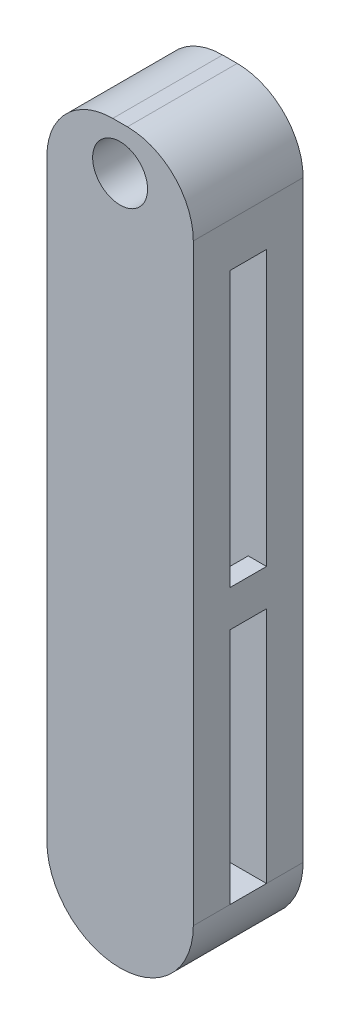
ISO-10303-21;
HEADER;
FILE_DESCRIPTION(('STEP AP214'),'2;1');
FILE_NAME('part.step','',(''),(''),'','','');
FILE_SCHEMA(('AUTOMOTIVE_DESIGN { 1 0 10303 214 1 1 1 1 }'));
ENDSEC;
DATA;
#1=APPLICATION_CONTEXT('core data for automotive mechanical design processes');
#2=APPLICATION_PROTOCOL_DEFINITION('international standard','automotive_design',2000,#1);
#3=PRODUCT_CONTEXT('',#1,'mechanical');
#4=PRODUCT('Part','Part','',(#3));
#5=PRODUCT_RELATED_PRODUCT_CATEGORY('part','',(#4));
#6=PRODUCT_DEFINITION_FORMATION('','',#4);
#7=PRODUCT_DEFINITION_CONTEXT('part definition',#1,'design');
#8=PRODUCT_DEFINITION('design','',#6,#7);
#9=PRODUCT_DEFINITION_SHAPE('','',#8);
#10=(LENGTH_UNIT() NAMED_UNIT(*) SI_UNIT(.MILLI.,.METRE.));
#11=(NAMED_UNIT(*) PLANE_ANGLE_UNIT() SI_UNIT($,.RADIAN.));
#12=(NAMED_UNIT(*) SI_UNIT($,.STERADIAN.) SOLID_ANGLE_UNIT());
#13=UNCERTAINTY_MEASURE_WITH_UNIT(LENGTH_MEASURE(1.E-05),#10,'distance_accuracy_value','');
#14=(GEOMETRIC_REPRESENTATION_CONTEXT(3) GLOBAL_UNCERTAINTY_ASSIGNED_CONTEXT((#13)) GLOBAL_UNIT_ASSIGNED_CONTEXT((#10,
#11,#12)) REPRESENTATION_CONTEXT('',''));
#15=CARTESIAN_POINT('',(0.,0.,0.));
#16=DIRECTION('',(0.,0.,1.));
#17=DIRECTION('',(1.,0.,0.));
#18=AXIS2_PLACEMENT_3D('',#15,#16,#17);
#19=CARTESIAN_POINT('',(20.,-80.,10.));
#20=DIRECTION('',(0.,0.,-1.));
#21=DIRECTION('',(0.,1.,0.));
#22=AXIS2_PLACEMENT_3D('',#19,#20,#21);
#23=PLANE('',#22);
#24=DIRECTION('',(0.,1.,0.));
#25=VECTOR('',#24,1.);
#26=CARTESIAN_POINT('',(15.,-80.,10.));
#27=LINE('',#26,#25);
#28=CARTESIAN_POINT('',(15.,-15.,10.));
#29=VERTEX_POINT('',#28);
#30=CARTESIAN_POINT('',(15.,-5.00000000000001,10.));
#31=VERTEX_POINT('',#30);
#32=EDGE_CURVE('E209',#29,#31,#27,.T.);
#33=ORIENTED_EDGE('',*,*,#32,.T.);
#34=DIRECTION('',(1.,0.,0.));
#35=VECTOR('',#34,1.);
#36=CARTESIAN_POINT('',(20.,-5.,10.));
#37=LINE('',#36,#35);
#38=CARTESIAN_POINT('',(20.,-5.,10.));
#39=VERTEX_POINT('',#38);
#40=EDGE_CURVE('E173',#31,#39,#37,.T.);
#41=ORIENTED_EDGE('',*,*,#40,.T.);
#42=DIRECTION('',(0.,-1.,0.));
#43=VECTOR('',#42,1.);
#44=CARTESIAN_POINT('',(20.,-80.,10.));
#45=LINE('',#44,#43);
#46=CARTESIAN_POINT('',(20.,70.,10.));
#47=VERTEX_POINT('',#46);
#48=EDGE_CURVE('E253',#47,#39,#45,.T.);
#49=ORIENTED_EDGE('',*,*,#48,.F.);
#50=DIRECTION('',(-1.,0.,0.));
#51=VECTOR('',#50,1.);
#52=CARTESIAN_POINT('',(20.,70.,10.));
#53=LINE('',#52,#51);
#54=CARTESIAN_POINT('',(-20.,70.,10.));
#55=VERTEX_POINT('',#54);
#56=EDGE_CURVE('E286',#47,#55,#53,.T.);
#57=ORIENTED_EDGE('',*,*,#56,.T.);
#58=DIRECTION('',(0.,-1.,0.));
#59=VECTOR('',#58,1.);
#60=CARTESIAN_POINT('',(-20.,-80.,10.));
#61=LINE('',#60,#59);
#62=CARTESIAN_POINT('',(-20.,-5.,10.));
#63=VERTEX_POINT('',#62);
#64=EDGE_CURVE('E271',#55,#63,#61,.T.);
#65=ORIENTED_EDGE('',*,*,#64,.T.);
#66=DIRECTION('',(-1.,0.,0.));
#67=VECTOR('',#66,1.);
#68=CARTESIAN_POINT('',(20.,-5.,10.));
#69=LINE('',#68,#67);
#70=CARTESIAN_POINT('',(-15.,-5.,10.));
#71=VERTEX_POINT('',#70);
#72=EDGE_CURVE('E240',#71,#63,#69,.T.);
#73=ORIENTED_EDGE('',*,*,#72,.F.);
#74=DIRECTION('',(0.,1.,0.));
#75=VECTOR('',#74,1.);
#76=CARTESIAN_POINT('',(-15.,-80.,10.));
#77=LINE('',#76,#75);
#78=CARTESIAN_POINT('',(-15.,-15.,10.));
#79=VERTEX_POINT('',#78);
#80=EDGE_CURVE('E248',#79,#71,#77,.T.);
#81=ORIENTED_EDGE('',*,*,#80,.F.);
#82=DIRECTION('',(1.,0.,0.));
#83=VECTOR('',#82,1.);
#84=CARTESIAN_POINT('',(20.,-15.,10.));
#85=LINE('',#84,#83);
#86=CARTESIAN_POINT('',(-20.,-15.,10.));
#87=VERTEX_POINT('',#86);
#88=EDGE_CURVE('E244',#87,#79,#85,.T.);
#89=ORIENTED_EDGE('',*,*,#88,.F.);
#90=CARTESIAN_POINT('',(-20.,-80.,10.));
#91=VERTEX_POINT('',#90);
#92=EDGE_CURVE('E252',#87,#91,#61,.T.);
#93=ORIENTED_EDGE('',*,*,#92,.T.);
#94=DIRECTION('',(-1.,0.,0.));
#95=VECTOR('',#94,1.);
#96=CARTESIAN_POINT('',(20.,-80.,10.));
#97=LINE('',#96,#95);
#98=CARTESIAN_POINT('',(20.,-80.,10.));
#99=VERTEX_POINT('',#98);
#100=EDGE_CURVE('E270',#99,#91,#97,.T.);
#101=ORIENTED_EDGE('',*,*,#100,.F.);
#102=CARTESIAN_POINT('',(20.,-15.,10.));
#103=VERTEX_POINT('',#102);
#104=EDGE_CURVE('E258',#103,#99,#45,.T.);
#105=ORIENTED_EDGE('',*,*,#104,.F.);
#106=DIRECTION('',(-1.,0.,0.));
#107=VECTOR('',#106,1.);
#108=CARTESIAN_POINT('',(20.,-15.,10.));
#109=LINE('',#108,#107);
#110=EDGE_CURVE('E177',#103,#29,#109,.T.);
#111=ORIENTED_EDGE('',*,*,#110,.T.);
#112=EDGE_LOOP('',(#33,#41,#49,#57,#65,#73,#81,#89,#93,#101,#105,#111));
#113=FACE_BOUND('',#112,.T.);
#114=ADVANCED_FACE('F39',(#113),#23,.F.);
#115=CARTESIAN_POINT('',(20.,-80.,20.));
#116=DIRECTION('',(0.,0.,1.));
#117=DIRECTION('',(1.,0.,0.));
#118=AXIS2_PLACEMENT_3D('',#115,#116,#117);
#119=PLANE('',#118);
#120=DIRECTION('',(0.,1.,0.));
#121=VECTOR('',#120,1.);
#122=CARTESIAN_POINT('',(20.,-80.,20.));
#123=LINE('',#122,#121);
#124=CARTESIAN_POINT('',(20.,-5.,20.));
#125=VERTEX_POINT('',#124);
#126=CARTESIAN_POINT('',(20.,70.,20.));
#127=VERTEX_POINT('',#126);
#128=EDGE_CURVE('E190',#125,#127,#123,.T.);
#129=ORIENTED_EDGE('',*,*,#128,.F.);
#130=DIRECTION('',(-1.,0.,0.));
#131=VECTOR('',#130,1.);
#132=CARTESIAN_POINT('',(20.,-5.,20.));
#133=LINE('',#132,#131);
#134=CARTESIAN_POINT('',(15.,-5.00000000000001,20.));
#135=VERTEX_POINT('',#134);
#136=EDGE_CURVE('E63',#125,#135,#133,.T.);
#137=ORIENTED_EDGE('',*,*,#136,.T.);
#138=DIRECTION('',(0.,-1.,0.));
#139=VECTOR('',#138,1.);
#140=CARTESIAN_POINT('',(15.,-5.00000000000001,20.));
#141=LINE('',#140,#139);
#142=CARTESIAN_POINT('',(15.,-15.,20.));
#143=VERTEX_POINT('',#142);
#144=EDGE_CURVE('E181',#135,#143,#141,.T.);
#145=ORIENTED_EDGE('',*,*,#144,.T.);
#146=DIRECTION('',(1.,0.,0.));
#147=VECTOR('',#146,1.);
#148=CARTESIAN_POINT('',(20.,-15.,20.));
#149=LINE('',#148,#147);
#150=CARTESIAN_POINT('',(20.,-15.,20.));
#151=VERTEX_POINT('',#150);
#152=EDGE_CURVE('E192',#143,#151,#149,.T.);
#153=ORIENTED_EDGE('',*,*,#152,.T.);
#154=CARTESIAN_POINT('',(20.,-80.,20.));
#155=VERTEX_POINT('',#154);
#156=EDGE_CURVE('E262',#155,#151,#123,.T.);
#157=ORIENTED_EDGE('',*,*,#156,.F.);
#158=DIRECTION('',(-1.,0.,0.));
#159=VECTOR('',#158,1.);
#160=CARTESIAN_POINT('',(20.,-80.,20.));
#161=LINE('',#160,#159);
#162=CARTESIAN_POINT('',(-20.,-80.,20.));
#163=VERTEX_POINT('',#162);
#164=EDGE_CURVE('E294',#155,#163,#161,.T.);
#165=ORIENTED_EDGE('',*,*,#164,.T.);
#166=DIRECTION('',(0.,1.,0.));
#167=VECTOR('',#166,1.);
#168=CARTESIAN_POINT('',(-20.,-80.,20.));
#169=LINE('',#168,#167);
#170=CARTESIAN_POINT('',(-20.,-15.,20.));
#171=VERTEX_POINT('',#170);
#172=EDGE_CURVE('E279',#163,#171,#169,.T.);
#173=ORIENTED_EDGE('',*,*,#172,.T.);
#174=DIRECTION('',(-1.,0.,0.));
#175=VECTOR('',#174,1.);
#176=CARTESIAN_POINT('',(-20.,-15.,20.));
#177=LINE('',#176,#175);
#178=CARTESIAN_POINT('',(-15.,-15.,20.));
#179=VERTEX_POINT('',#178);
#180=EDGE_CURVE('E216',#179,#171,#177,.T.);
#181=ORIENTED_EDGE('',*,*,#180,.F.);
#182=DIRECTION('',(0.,-1.,0.));
#183=VECTOR('',#182,1.);
#184=CARTESIAN_POINT('',(-15.,-5.00000000000001,20.));
#185=LINE('',#184,#183);
#186=CARTESIAN_POINT('',(-15.,-5.00000000000001,20.));
#187=VERTEX_POINT('',#186);
#188=EDGE_CURVE('E212',#187,#179,#185,.T.);
#189=ORIENTED_EDGE('',*,*,#188,.F.);
#190=DIRECTION('',(1.,0.,0.));
#191=VECTOR('',#190,1.);
#192=CARTESIAN_POINT('',(-20.,-5.,20.));
#193=LINE('',#192,#191);
#194=CARTESIAN_POINT('',(-20.,-4.99999999999999,20.));
#195=VERTEX_POINT('',#194);
#196=EDGE_CURVE('E220',#195,#187,#193,.T.);
#197=ORIENTED_EDGE('',*,*,#196,.F.);
#198=CARTESIAN_POINT('',(-20.,70.,20.));
#199=VERTEX_POINT('',#198);
#200=EDGE_CURVE('E278',#195,#199,#169,.T.);
#201=ORIENTED_EDGE('',*,*,#200,.T.);
#202=DIRECTION('',(-1.,0.,0.));
#203=VECTOR('',#202,1.);
#204=CARTESIAN_POINT('',(20.,70.,20.));
#205=LINE('',#204,#203);
#206=EDGE_CURVE('E290',#127,#199,#205,.T.);
#207=ORIENTED_EDGE('',*,*,#206,.F.);
#208=EDGE_LOOP('',(#129,#137,#145,#153,#157,#165,#173,#181,#189,#197,#201,#207));
#209=FACE_BOUND('',#208,.T.);
#210=ADVANCED_FACE('F188',(#209),#119,.F.);
#211=CARTESIAN_POINT('',(20.,-100.,30.));
#212=DIRECTION('',(-1.,0.,0.));
#213=DIRECTION('',(0.,0.,1.));
#214=AXIS2_PLACEMENT_3D('',#211,#212,#213);
#215=PLANE('',#214);
#216=DIRECTION('',(0.,0.,1.));
#217=VECTOR('',#216,1.);
#218=CARTESIAN_POINT('',(20.,-15.,5.));
#219=LINE('',#218,#217);
#220=EDGE_CURVE('E199',#103,#151,#219,.T.);
#221=ORIENTED_EDGE('',*,*,#220,.F.);
#222=ORIENTED_EDGE('',*,*,#104,.T.);
#223=DIRECTION('',(0.,0.,-1.));
#224=VECTOR('',#223,1.);
#225=CARTESIAN_POINT('',(20.,-80.,30.));
#226=LINE('',#225,#224);
#227=CARTESIAN_POINT('',(20.,-80.,0.));
#228=VERTEX_POINT('',#227);
#229=EDGE_CURVE('E330',#99,#228,#226,.T.);
#230=ORIENTED_EDGE('',*,*,#229,.T.);
#231=DIRECTION('',(0.,1.,0.));
#232=VECTOR('',#231,1.);
#233=CARTESIAN_POINT('',(20.,-100.,0.));
#234=LINE('',#233,#232);
#235=CARTESIAN_POINT('',(20.,82.,0.));
#236=VERTEX_POINT('',#235);
#237=EDGE_CURVE('E312',#228,#236,#234,.T.);
#238=ORIENTED_EDGE('',*,*,#237,.T.);
#239=DIRECTION('',(0.,0.,-1.));
#240=VECTOR('',#239,1.);
#241=CARTESIAN_POINT('',(20.,82.,30.));
#242=LINE('',#241,#240);
#243=CARTESIAN_POINT('',(20.,82.,30.));
#244=VERTEX_POINT('',#243);
#245=EDGE_CURVE('E378',#236,#244,#242,.F.);
#246=ORIENTED_EDGE('',*,*,#245,.T.);
#247=DIRECTION('',(0.,1.,0.));
#248=VECTOR('',#247,1.);
#249=CARTESIAN_POINT('',(20.,-100.,30.));
#250=LINE('',#249,#248);
#251=CARTESIAN_POINT('',(20.,-80.,30.));
#252=VERTEX_POINT('',#251);
#253=EDGE_CURVE('E317',#252,#244,#250,.T.);
#254=ORIENTED_EDGE('',*,*,#253,.F.);
#255=EDGE_CURVE('E340',#252,#155,#226,.T.);
#256=ORIENTED_EDGE('',*,*,#255,.T.);
#257=ORIENTED_EDGE('',*,*,#156,.T.);
#258=EDGE_LOOP('',(#221,#222,#230,#238,#246,#254,#256,#257));
#259=FACE_BOUND('',#258,.T.);
#260=ORIENTED_EDGE('',*,*,#48,.T.);
#261=DIRECTION('',(0.,0.,1.));
#262=VECTOR('',#261,1.);
#263=CARTESIAN_POINT('',(20.,-5.,5.));
#264=LINE('',#263,#262);
#265=EDGE_CURVE('E178',#39,#125,#264,.T.);
#266=ORIENTED_EDGE('',*,*,#265,.T.);
#267=ORIENTED_EDGE('',*,*,#128,.T.);
#268=DIRECTION('',(0.,0.,-1.));
#269=VECTOR('',#268,1.);
#270=CARTESIAN_POINT('',(20.,70.,10.));
#271=LINE('',#270,#269);
#272=EDGE_CURVE('E266',#127,#47,#271,.T.);
#273=ORIENTED_EDGE('',*,*,#272,.T.);
#274=EDGE_LOOP('',(#260,#266,#267,#273));
#275=FACE_BOUND('',#274,.T.);
#276=ADVANCED_FACE('F403',(#259,#275),#215,.F.);
#277=CARTESIAN_POINT('',(-20.,100.,30.));
#278=DIRECTION('',(0.,-1.,0.));
#279=DIRECTION('',(0.,0.,-1.));
#280=AXIS2_PLACEMENT_3D('',#277,#278,#279);
#281=PLANE('',#280);
#282=DIRECTION('',(-1.,0.,0.));
#283=VECTOR('',#282,1.);
#284=CARTESIAN_POINT('',(-20.,100.,30.));
#285=LINE('',#284,#283);
#286=CARTESIAN_POINT('',(2.00000000000001,100.,30.));
#287=VERTEX_POINT('',#286);
#288=CARTESIAN_POINT('',(-2.,100.,30.));
#289=VERTEX_POINT('',#288);
#290=EDGE_CURVE('E321',#287,#289,#285,.T.);
#291=ORIENTED_EDGE('',*,*,#290,.F.);
#292=DIRECTION('',(0.,0.,-1.));
#293=VECTOR('',#292,1.);
#294=CARTESIAN_POINT('',(2.00000000000001,100.,30.));
#295=LINE('',#294,#293);
#296=CARTESIAN_POINT('',(2.00000000000001,100.,0.));
#297=VERTEX_POINT('',#296);
#298=EDGE_CURVE('E368',#287,#297,#295,.T.);
#299=ORIENTED_EDGE('',*,*,#298,.T.);
#300=DIRECTION('',(-1.,0.,0.));
#301=VECTOR('',#300,1.);
#302=CARTESIAN_POINT('',(-20.,100.,0.));
#303=LINE('',#302,#301);
#304=CARTESIAN_POINT('',(-2.,100.,0.));
#305=VERTEX_POINT('',#304);
#306=EDGE_CURVE('E334',#297,#305,#303,.T.);
#307=ORIENTED_EDGE('',*,*,#306,.T.);
#308=DIRECTION('',(0.,0.,-1.));
#309=VECTOR('',#308,1.);
#310=CARTESIAN_POINT('',(-2.,100.,30.));
#311=LINE('',#310,#309);
#312=EDGE_CURVE('E362',#305,#289,#311,.F.);
#313=ORIENTED_EDGE('',*,*,#312,.T.);
#314=EDGE_LOOP('',(#291,#299,#307,#313));
#315=FACE_BOUND('',#314,.T.);
#316=ADVANCED_FACE('F394',(#315),#281,.F.);
#317=CARTESIAN_POINT('',(-20.,-100.,30.));
#318=DIRECTION('',(1.,0.,0.));
#319=DIRECTION('',(0.,0.,-1.));
#320=AXIS2_PLACEMENT_3D('',#317,#318,#319);
#321=PLANE('',#320);
#322=ORIENTED_EDGE('',*,*,#92,.F.);
#323=DIRECTION('',(0.,0.,1.));
#324=VECTOR('',#323,1.);
#325=CARTESIAN_POINT('',(-20.,-15.,5.));
#326=LINE('',#325,#324);
#327=EDGE_CURVE('E232',#87,#171,#326,.T.);
#328=ORIENTED_EDGE('',*,*,#327,.T.);
#329=ORIENTED_EDGE('',*,*,#172,.F.);
#330=DIRECTION('',(0.,0.,-1.));
#331=VECTOR('',#330,1.);
#332=CARTESIAN_POINT('',(-20.,-80.,30.));
#333=LINE('',#332,#331);
#334=CARTESIAN_POINT('',(-20.,-80.,30.));
#335=VERTEX_POINT('',#334);
#336=EDGE_CURVE('E357',#163,#335,#333,.F.);
#337=ORIENTED_EDGE('',*,*,#336,.T.);
#338=DIRECTION('',(0.,-1.,0.));
#339=VECTOR('',#338,1.);
#340=CARTESIAN_POINT('',(-20.,-100.,30.));
#341=LINE('',#340,#339);
#342=CARTESIAN_POINT('',(-20.,82.,30.));
#343=VERTEX_POINT('',#342);
#344=EDGE_CURVE('E326',#343,#335,#341,.T.);
#345=ORIENTED_EDGE('',*,*,#344,.F.);
#346=DIRECTION('',(0.,0.,-1.));
#347=VECTOR('',#346,1.);
#348=CARTESIAN_POINT('',(-20.,82.,30.));
#349=LINE('',#348,#347);
#350=CARTESIAN_POINT('',(-20.,82.,0.));
#351=VERTEX_POINT('',#350);
#352=EDGE_CURVE('E11',#343,#351,#349,.T.);
#353=ORIENTED_EDGE('',*,*,#352,.T.);
#354=DIRECTION('',(0.,-1.,0.));
#355=VECTOR('',#354,1.);
#356=CARTESIAN_POINT('',(-20.,-100.,0.));
#357=LINE('',#356,#355);
#358=CARTESIAN_POINT('',(-20.,-80.,0.));
#359=VERTEX_POINT('',#358);
#360=EDGE_CURVE('E322',#351,#359,#357,.T.);
#361=ORIENTED_EDGE('',*,*,#360,.T.);
#362=EDGE_CURVE('E358',#359,#91,#333,.F.);
#363=ORIENTED_EDGE('',*,*,#362,.T.);
#364=EDGE_LOOP('',(#322,#328,#329,#337,#345,#353,#361,#363));
#365=FACE_BOUND('',#364,.T.);
#366=DIRECTION('',(0.,0.,1.));
#367=VECTOR('',#366,1.);
#368=CARTESIAN_POINT('',(-20.,-5.,5.));
#369=LINE('',#368,#367);
#370=EDGE_CURVE('E228',#63,#195,#369,.T.);
#371=ORIENTED_EDGE('',*,*,#370,.F.);
#372=ORIENTED_EDGE('',*,*,#64,.F.);
#373=DIRECTION('',(0.,0.,-1.));
#374=VECTOR('',#373,1.);
#375=CARTESIAN_POINT('',(-20.,70.,10.));
#376=LINE('',#375,#374);
#377=EDGE_CURVE('E282',#199,#55,#376,.T.);
#378=ORIENTED_EDGE('',*,*,#377,.F.);
#379=ORIENTED_EDGE('',*,*,#200,.F.);
#380=EDGE_LOOP('',(#371,#372,#378,#379));
#381=FACE_BOUND('',#380,.T.);
#382=ADVANCED_FACE('F424',(#365,#381),#321,.F.);
#383=CARTESIAN_POINT('',(0.,0.,30.));
#384=DIRECTION('',(0.,0.,-1.));
#385=DIRECTION('',(-1.,0.,0.));
#386=AXIS2_PLACEMENT_3D('',#383,#384,#385);
#387=PLANE('',#386);
#388=CARTESIAN_POINT('',(0.,88.,30.));
#389=DIRECTION('',(0.,0.,1.));
#390=DIRECTION('',(1.,0.,0.));
#391=AXIS2_PLACEMENT_3D('',#388,#389,#390);
#392=CIRCLE('',#391,7.5);
#393=CARTESIAN_POINT('',(7.5,88.,30.));
#394=VERTEX_POINT('',#393);
#395=EDGE_CURVE('E289',#394,#394,#392,.T.);
#396=ORIENTED_EDGE('',*,*,#395,.F.);
#397=EDGE_LOOP('',(#396));
#398=FACE_BOUND('',#397,.T.);
#399=ORIENTED_EDGE('',*,*,#253,.T.);
#400=CARTESIAN_POINT('',(2.00000000000001,82.,30.));
#401=DIRECTION('',(0.,0.,-1.));
#402=DIRECTION('',(-1.,0.,0.));
#403=AXIS2_PLACEMENT_3D('',#400,#401,#402);
#404=CIRCLE('',#403,18.);
#405=EDGE_CURVE('E48',#244,#287,#404,.F.);
#406=ORIENTED_EDGE('',*,*,#405,.T.);
#407=ORIENTED_EDGE('',*,*,#290,.T.);
#408=CARTESIAN_POINT('',(-2.,82.,30.));
#409=DIRECTION('',(0.,0.,-1.));
#410=DIRECTION('',(-1.,0.,0.));
#411=AXIS2_PLACEMENT_3D('',#408,#409,#410);
#412=CIRCLE('',#411,18.);
#413=EDGE_CURVE('E381',#289,#343,#412,.F.);
#414=ORIENTED_EDGE('',*,*,#413,.T.);
#415=ORIENTED_EDGE('',*,*,#344,.T.);
#416=CARTESIAN_POINT('',(0.,-80.,30.));
#417=DIRECTION('',(0.,0.,-1.));
#418=DIRECTION('',(-1.,0.,0.));
#419=AXIS2_PLACEMENT_3D('',#416,#417,#418);
#420=CIRCLE('',#419,20.);
#421=CARTESIAN_POINT('',(0.,-100.,30.));
#422=VERTEX_POINT('',#421);
#423=EDGE_CURVE('E351',#335,#422,#420,.F.);
#424=ORIENTED_EDGE('',*,*,#423,.T.);
#425=CARTESIAN_POINT('',(0.,-80.,30.));
#426=DIRECTION('',(0.,0.,-1.));
#427=DIRECTION('',(-1.,0.,0.));
#428=AXIS2_PLACEMENT_3D('',#425,#426,#427);
#429=CIRCLE('',#428,20.);
#430=EDGE_CURVE('E354',#422,#252,#429,.F.);
#431=ORIENTED_EDGE('',*,*,#430,.T.);
#432=EDGE_LOOP('',(#399,#406,#407,#414,#415,#424,#431));
#433=FACE_BOUND('',#432,.T.);
#434=ADVANCED_FACE('F387',(#398,#433),#387,.F.);
#435=CARTESIAN_POINT('',(0.,0.,0.));
#436=DIRECTION('',(0.,0.,-1.));
#437=DIRECTION('',(-1.,0.,0.));
#438=AXIS2_PLACEMENT_3D('',#435,#436,#437);
#439=PLANE('',#438);
#440=CARTESIAN_POINT('',(0.,-90.,0.));
#441=DIRECTION('',(0.,0.,-1.));
#442=DIRECTION('',(-1.,0.,0.));
#443=AXIS2_PLACEMENT_3D('',#440,#441,#442);
#444=CIRCLE('',#443,2.);
#445=CARTESIAN_POINT('',(-2.,-90.,0.));
#446=VERTEX_POINT('',#445);
#447=EDGE_CURVE('E313',#446,#446,#444,.T.);
#448=ORIENTED_EDGE('',*,*,#447,.F.);
#449=EDGE_LOOP('',(#448));
#450=FACE_BOUND('',#449,.T.);
#451=ORIENTED_EDGE('',*,*,#306,.F.);
#452=CARTESIAN_POINT('',(2.00000000000001,82.,0.));
#453=DIRECTION('',(0.,0.,-1.));
#454=DIRECTION('',(-1.,0.,0.));
#455=AXIS2_PLACEMENT_3D('',#452,#453,#454);
#456=CIRCLE('',#455,18.);
#457=EDGE_CURVE('E375',#297,#236,#456,.T.);
#458=ORIENTED_EDGE('',*,*,#457,.T.);
#459=ORIENTED_EDGE('',*,*,#237,.F.);
#460=CARTESIAN_POINT('',(0.,-80.,0.));
#461=DIRECTION('',(0.,0.,-1.));
#462=DIRECTION('',(-1.,0.,0.));
#463=AXIS2_PLACEMENT_3D('',#460,#461,#462);
#464=CIRCLE('',#463,20.);
#465=CARTESIAN_POINT('',(0.,-100.,0.));
#466=VERTEX_POINT('',#465);
#467=EDGE_CURVE('E348',#228,#466,#464,.T.);
#468=ORIENTED_EDGE('',*,*,#467,.T.);
#469=CARTESIAN_POINT('',(0.,-80.,0.));
#470=DIRECTION('',(0.,0.,-1.));
#471=DIRECTION('',(-1.,0.,0.));
#472=AXIS2_PLACEMENT_3D('',#469,#470,#471);
#473=CIRCLE('',#472,20.);
#474=EDGE_CURVE('E344',#466,#359,#473,.T.);
#475=ORIENTED_EDGE('',*,*,#474,.T.);
#476=ORIENTED_EDGE('',*,*,#360,.F.);
#477=CARTESIAN_POINT('',(-2.,82.,0.));
#478=DIRECTION('',(0.,0.,-1.));
#479=DIRECTION('',(-1.,0.,0.));
#480=AXIS2_PLACEMENT_3D('',#477,#478,#479);
#481=CIRCLE('',#480,18.);
#482=EDGE_CURVE('E372',#351,#305,#481,.T.);
#483=ORIENTED_EDGE('',*,*,#482,.T.);
#484=EDGE_LOOP('',(#451,#458,#459,#468,#475,#476,#483));
#485=FACE_BOUND('',#484,.T.);
#486=ADVANCED_FACE('F400',(#450,#485),#439,.T.);
#487=CARTESIAN_POINT('',(0.,-90.,10.));
#488=DIRECTION('',(0.,0.,-1.));
#489=DIRECTION('',(-1.,0.,0.));
#490=AXIS2_PLACEMENT_3D('',#487,#488,#489);
#491=CYLINDRICAL_SURFACE('',#490,2.);
#492=CARTESIAN_POINT('',(0.,-90.,10.));
#493=DIRECTION('',(0.,0.,-1.));
#494=DIRECTION('',(-1.,0.,0.));
#495=AXIS2_PLACEMENT_3D('',#492,#493,#494);
#496=CIRCLE('',#495,2.);
#497=CARTESIAN_POINT('',(-2.,-90.,10.));
#498=VERTEX_POINT('',#497);
#499=EDGE_CURVE('E308',#498,#498,#496,.T.);
#500=ORIENTED_EDGE('',*,*,#499,.F.);
#501=EDGE_LOOP('',(#500));
#502=FACE_BOUND('',#501,.T.);
#503=ORIENTED_EDGE('',*,*,#447,.T.);
#504=EDGE_LOOP('',(#503));
#505=FACE_BOUND('',#504,.T.);
#506=ADVANCED_FACE('F486',(#502,#505),#491,.F.);
#507=CARTESIAN_POINT('',(0.,-90.,10.));
#508=DIRECTION('',(0.,0.,-1.));
#509=DIRECTION('',(-1.,0.,0.));
#510=AXIS2_PLACEMENT_3D('',#507,#508,#509);
#511=PLANE('',#510);
#512=ORIENTED_EDGE('',*,*,#499,.T.);
#513=EDGE_LOOP('',(#512));
#514=FACE_BOUND('',#513,.T.);
#515=ADVANCED_FACE('F483',(#514),#511,.T.);
#516=CARTESIAN_POINT('',(0.,-80.,30.));
#517=DIRECTION('',(0.,0.,-1.));
#518=DIRECTION('',(-1.,0.,0.));
#519=AXIS2_PLACEMENT_3D('',#516,#517,#518);
#520=CYLINDRICAL_SURFACE('',#519,20.);
#521=DIRECTION('',(0.,0.,-1.));
#522=VECTOR('',#521,1.);
#523=CARTESIAN_POINT('',(0.,-100.,30.));
#524=LINE('',#523,#522);
#525=EDGE_CURVE('E304',#422,#466,#524,.T.);
#526=ORIENTED_EDGE('',*,*,#525,.F.);
#527=ORIENTED_EDGE('',*,*,#423,.F.);
#528=ORIENTED_EDGE('',*,*,#336,.F.);
#529=DIRECTION('',(0.,0.,1.));
#530=VECTOR('',#529,1.);
#531=CARTESIAN_POINT('',(-20.,-80.,10.));
#532=LINE('',#531,#530);
#533=EDGE_CURVE('E274',#91,#163,#532,.T.);
#534=ORIENTED_EDGE('',*,*,#533,.F.);
#535=ORIENTED_EDGE('',*,*,#362,.F.);
#536=ORIENTED_EDGE('',*,*,#474,.F.);
#537=EDGE_LOOP('',(#526,#527,#528,#534,#535,#536));
#538=FACE_BOUND('',#537,.T.);
#539=ADVANCED_FACE('F418',(#538),#520,.T.);
#540=CARTESIAN_POINT('',(0.,-80.,30.));
#541=DIRECTION('',(0.,0.,-1.));
#542=DIRECTION('',(-1.,0.,0.));
#543=AXIS2_PLACEMENT_3D('',#540,#541,#542);
#544=CYLINDRICAL_SURFACE('',#543,20.);
#545=ORIENTED_EDGE('',*,*,#430,.F.);
#546=ORIENTED_EDGE('',*,*,#525,.T.);
#547=ORIENTED_EDGE('',*,*,#467,.F.);
#548=ORIENTED_EDGE('',*,*,#229,.F.);
#549=DIRECTION('',(0.,0.,1.));
#550=VECTOR('',#549,1.);
#551=CARTESIAN_POINT('',(20.,-80.,10.));
#552=LINE('',#551,#550);
#553=EDGE_CURVE('E257',#99,#155,#552,.T.);
#554=ORIENTED_EDGE('',*,*,#553,.T.);
#555=ORIENTED_EDGE('',*,*,#255,.F.);
#556=EDGE_LOOP('',(#545,#546,#547,#548,#554,#555));
#557=FACE_BOUND('',#556,.T.);
#558=ADVANCED_FACE('F412',(#557),#544,.T.);
#559=CARTESIAN_POINT('',(0.,88.,10.));
#560=DIRECTION('',(0.,0.,1.));
#561=DIRECTION('',(1.,0.,0.));
#562=AXIS2_PLACEMENT_3D('',#559,#560,#561);
#563=CYLINDRICAL_SURFACE('',#562,7.5);
#564=CARTESIAN_POINT('',(0.,88.,10.));
#565=DIRECTION('',(0.,0.,1.));
#566=DIRECTION('',(1.,0.,0.));
#567=AXIS2_PLACEMENT_3D('',#564,#565,#566);
#568=CIRCLE('',#567,7.5);
#569=CARTESIAN_POINT('',(7.5,88.,10.));
#570=VERTEX_POINT('',#569);
#571=EDGE_CURVE('E300',#570,#570,#568,.T.);
#572=ORIENTED_EDGE('',*,*,#571,.F.);
#573=EDGE_LOOP('',(#572));
#574=FACE_BOUND('',#573,.T.);
#575=ORIENTED_EDGE('',*,*,#395,.T.);
#576=EDGE_LOOP('',(#575));
#577=FACE_BOUND('',#576,.T.);
#578=ADVANCED_FACE('F478',(#574,#577),#563,.F.);
#579=CARTESIAN_POINT('',(0.,88.,10.));
#580=DIRECTION('',(0.,0.,1.));
#581=DIRECTION('',(1.,0.,0.));
#582=AXIS2_PLACEMENT_3D('',#579,#580,#581);
#583=PLANE('',#582);
#584=ORIENTED_EDGE('',*,*,#571,.T.);
#585=EDGE_LOOP('',(#584));
#586=FACE_BOUND('',#585,.T.);
#587=ADVANCED_FACE('F475',(#586),#583,.T.);
#588=CARTESIAN_POINT('',(2.00000000000001,82.,30.));
#589=DIRECTION('',(0.,0.,-1.));
#590=DIRECTION('',(-1.,0.,0.));
#591=AXIS2_PLACEMENT_3D('',#588,#589,#590);
#592=CYLINDRICAL_SURFACE('',#591,18.);
#593=ORIENTED_EDGE('',*,*,#405,.F.);
#594=ORIENTED_EDGE('',*,*,#245,.F.);
#595=ORIENTED_EDGE('',*,*,#457,.F.);
#596=ORIENTED_EDGE('',*,*,#298,.F.);
#597=EDGE_LOOP('',(#593,#594,#595,#596));
#598=FACE_BOUND('',#597,.T.);
#599=ADVANCED_FACE('F397',(#598),#592,.T.);
#600=CARTESIAN_POINT('',(-2.,82.,30.));
#601=DIRECTION('',(0.,0.,-1.));
#602=DIRECTION('',(-1.,0.,0.));
#603=AXIS2_PLACEMENT_3D('',#600,#601,#602);
#604=CYLINDRICAL_SURFACE('',#603,18.);
#605=ORIENTED_EDGE('',*,*,#413,.F.);
#606=ORIENTED_EDGE('',*,*,#312,.F.);
#607=ORIENTED_EDGE('',*,*,#482,.F.);
#608=ORIENTED_EDGE('',*,*,#352,.F.);
#609=EDGE_LOOP('',(#605,#606,#607,#608));
#610=FACE_BOUND('',#609,.T.);
#611=ADVANCED_FACE('F41',(#610),#604,.T.);
#612=CARTESIAN_POINT('',(20.,70.,10.));
#613=DIRECTION('',(0.,1.,0.));
#614=DIRECTION('',(0.,0.,1.));
#615=AXIS2_PLACEMENT_3D('',#612,#613,#614);
#616=PLANE('',#615);
#617=ORIENTED_EDGE('',*,*,#377,.T.);
#618=ORIENTED_EDGE('',*,*,#56,.F.);
#619=ORIENTED_EDGE('',*,*,#272,.F.);
#620=ORIENTED_EDGE('',*,*,#206,.T.);
#621=EDGE_LOOP('',(#617,#618,#619,#620));
#622=FACE_BOUND('',#621,.T.);
#623=ADVANCED_FACE('F446',(#622),#616,.F.);
#624=CARTESIAN_POINT('',(20.,-80.,10.));
#625=DIRECTION('',(0.,-1.,0.));
#626=DIRECTION('',(0.,0.,-1.));
#627=AXIS2_PLACEMENT_3D('',#624,#625,#626);
#628=PLANE('',#627);
#629=ORIENTED_EDGE('',*,*,#533,.T.);
#630=ORIENTED_EDGE('',*,*,#164,.F.);
#631=ORIENTED_EDGE('',*,*,#553,.F.);
#632=ORIENTED_EDGE('',*,*,#100,.T.);
#633=EDGE_LOOP('',(#629,#630,#631,#632));
#634=FACE_BOUND('',#633,.T.);
#635=ADVANCED_FACE('F439',(#634),#628,.F.);
#636=CARTESIAN_POINT('',(-15.,-5.00000000000001,5.));
#637=DIRECTION('',(-1.,0.,0.));
#638=DIRECTION('',(0.,0.,1.));
#639=AXIS2_PLACEMENT_3D('',#636,#637,#638);
#640=PLANE('',#639);
#641=DIRECTION('',(0.,0.,1.));
#642=VECTOR('',#641,1.);
#643=CARTESIAN_POINT('',(-15.,-15.,5.));
#644=LINE('',#643,#642);
#645=EDGE_CURVE('E236',#79,#179,#644,.T.);
#646=ORIENTED_EDGE('',*,*,#645,.F.);
#647=ORIENTED_EDGE('',*,*,#80,.T.);
#648=DIRECTION('',(0.,0.,1.));
#649=VECTOR('',#648,1.);
#650=CARTESIAN_POINT('',(-15.,-5.00000000000001,5.));
#651=LINE('',#650,#649);
#652=EDGE_CURVE('E224',#71,#187,#651,.T.);
#653=ORIENTED_EDGE('',*,*,#652,.T.);
#654=ORIENTED_EDGE('',*,*,#188,.T.);
#655=EDGE_LOOP('',(#646,#647,#653,#654));
#656=FACE_BOUND('',#655,.T.);
#657=ADVANCED_FACE('F456',(#656),#640,.F.);
#658=CARTESIAN_POINT('',(-20.,-15.,5.));
#659=DIRECTION('',(0.,1.,0.));
#660=DIRECTION('',(0.,0.,1.));
#661=AXIS2_PLACEMENT_3D('',#658,#659,#660);
#662=PLANE('',#661);
#663=ORIENTED_EDGE('',*,*,#327,.F.);
#664=ORIENTED_EDGE('',*,*,#88,.T.);
#665=ORIENTED_EDGE('',*,*,#645,.T.);
#666=ORIENTED_EDGE('',*,*,#180,.T.);
#667=EDGE_LOOP('',(#663,#664,#665,#666));
#668=FACE_BOUND('',#667,.T.);
#669=ADVANCED_FACE('F458',(#668),#662,.F.);
#670=CARTESIAN_POINT('',(-20.,-5.,5.));
#671=DIRECTION('',(0.,-1.,0.));
#672=DIRECTION('',(1.,0.,0.));
#673=AXIS2_PLACEMENT_3D('',#670,#671,#672);
#674=PLANE('',#673);
#675=ORIENTED_EDGE('',*,*,#652,.F.);
#676=ORIENTED_EDGE('',*,*,#72,.T.);
#677=ORIENTED_EDGE('',*,*,#370,.T.);
#678=ORIENTED_EDGE('',*,*,#196,.T.);
#679=EDGE_LOOP('',(#675,#676,#677,#678));
#680=FACE_BOUND('',#679,.T.);
#681=ADVANCED_FACE('F452',(#680),#674,.F.);
#682=CARTESIAN_POINT('',(15.,-5.00000000000001,5.));
#683=DIRECTION('',(-1.,0.,0.));
#684=DIRECTION('',(0.,0.,1.));
#685=AXIS2_PLACEMENT_3D('',#682,#683,#684);
#686=PLANE('',#685);
#687=ORIENTED_EDGE('',*,*,#32,.F.);
#688=DIRECTION('',(0.,0.,1.));
#689=VECTOR('',#688,1.);
#690=CARTESIAN_POINT('',(15.,-15.,5.));
#691=LINE('',#690,#689);
#692=EDGE_CURVE('E55',#29,#143,#691,.T.);
#693=ORIENTED_EDGE('',*,*,#692,.T.);
#694=ORIENTED_EDGE('',*,*,#144,.F.);
#695=DIRECTION('',(0.,0.,1.));
#696=VECTOR('',#695,1.);
#697=CARTESIAN_POINT('',(15.,-5.00000000000001,5.));
#698=LINE('',#697,#696);
#699=EDGE_CURVE('E169',#31,#135,#698,.T.);
#700=ORIENTED_EDGE('',*,*,#699,.F.);
#701=EDGE_LOOP('',(#687,#693,#694,#700));
#702=FACE_BOUND('',#701,.T.);
#703=ADVANCED_FACE('F182',(#702),#686,.T.);
#704=CARTESIAN_POINT('',(20.,-5.,5.));
#705=DIRECTION('',(0.,1.,0.));
#706=DIRECTION('',(-1.,0.,0.));
#707=AXIS2_PLACEMENT_3D('',#704,#705,#706);
#708=PLANE('',#707);
#709=ORIENTED_EDGE('',*,*,#40,.F.);
#710=ORIENTED_EDGE('',*,*,#699,.T.);
#711=ORIENTED_EDGE('',*,*,#136,.F.);
#712=ORIENTED_EDGE('',*,*,#265,.F.);
#713=EDGE_LOOP('',(#709,#710,#711,#712));
#714=FACE_BOUND('',#713,.T.);
#715=ADVANCED_FACE('F171',(#714),#708,.T.);
#716=CARTESIAN_POINT('',(20.,-15.,5.));
#717=DIRECTION('',(0.,-1.,0.));
#718=DIRECTION('',(0.,0.,-1.));
#719=AXIS2_PLACEMENT_3D('',#716,#717,#718);
#720=PLANE('',#719);
#721=ORIENTED_EDGE('',*,*,#110,.F.);
#722=ORIENTED_EDGE('',*,*,#220,.T.);
#723=ORIENTED_EDGE('',*,*,#152,.F.);
#724=ORIENTED_EDGE('',*,*,#692,.F.);
#725=EDGE_LOOP('',(#721,#722,#723,#724));
#726=FACE_BOUND('',#725,.T.);
#727=ADVANCED_FACE('F442',(#726),#720,.T.);
#728=CLOSED_SHELL('',(#114,#210,#276,#316,#382,#434,#486,#506,#515,#539,#558,#578,#587,#599,
#611,#623,#635,#657,#669,#681,#703,#715,#727));
#729=MANIFOLD_SOLID_BREP('B2',#728);
#730=ADVANCED_BREP_SHAPE_REPRESENTATION('',(#18,#729),#14);
#731=SHAPE_DEFINITION_REPRESENTATION(#9,#730);
ENDSEC;
END-ISO-10303-21;
